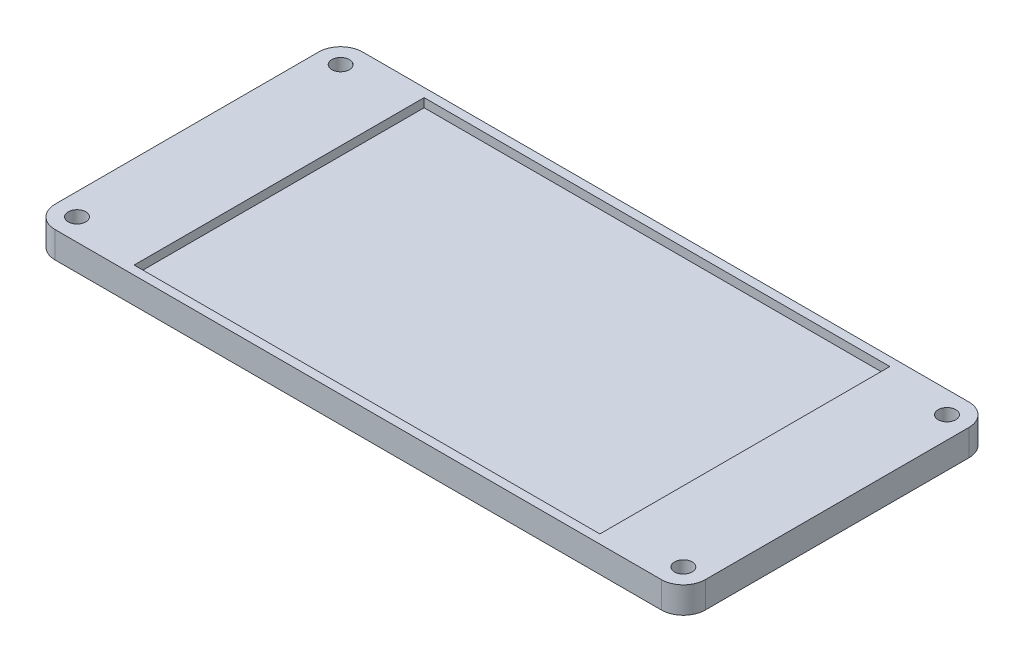
ISO-10303-21;
HEADER;
FILE_DESCRIPTION(('STEP AP214'),'2;1');
FILE_NAME('part.step','',(''),(''),'','','');
FILE_SCHEMA(('AUTOMOTIVE_DESIGN { 1 0 10303 214 1 1 1 1 }'));
ENDSEC;
DATA;
#1=APPLICATION_CONTEXT('core data for automotive mechanical design processes');
#2=APPLICATION_PROTOCOL_DEFINITION('international standard','automotive_design',2000,#1);
#3=PRODUCT_CONTEXT('',#1,'mechanical');
#4=PRODUCT('Part','Part','',(#3));
#5=PRODUCT_RELATED_PRODUCT_CATEGORY('part','',(#4));
#6=PRODUCT_DEFINITION_FORMATION('','',#4);
#7=PRODUCT_DEFINITION_CONTEXT('part definition',#1,'design');
#8=PRODUCT_DEFINITION('design','',#6,#7);
#9=PRODUCT_DEFINITION_SHAPE('','',#8);
#10=(LENGTH_UNIT() NAMED_UNIT(*) SI_UNIT(.MILLI.,.METRE.));
#11=(NAMED_UNIT(*) PLANE_ANGLE_UNIT() SI_UNIT($,.RADIAN.));
#12=(NAMED_UNIT(*) SI_UNIT($,.STERADIAN.) SOLID_ANGLE_UNIT());
#13=UNCERTAINTY_MEASURE_WITH_UNIT(LENGTH_MEASURE(1.E-05),#10,'distance_accuracy_value','');
#14=(GEOMETRIC_REPRESENTATION_CONTEXT(3) GLOBAL_UNCERTAINTY_ASSIGNED_CONTEXT((#13)) GLOBAL_UNIT_ASSIGNED_CONTEXT((#10,
#11,#12)) REPRESENTATION_CONTEXT('',''));
#15=CARTESIAN_POINT('',(0.,0.,0.));
#16=DIRECTION('',(0.,0.,1.));
#17=DIRECTION('',(1.,0.,0.));
#18=AXIS2_PLACEMENT_3D('',#15,#16,#17);
#19=CARTESIAN_POINT('',(37.,3.,17.5));
#20=DIRECTION('',(-1.,0.,0.));
#21=DIRECTION('',(0.,0.,1.));
#22=AXIS2_PLACEMENT_3D('',#19,#20,#21);
#23=PLANE('',#22);
#24=DIRECTION('',(0.,0.,-1.));
#25=VECTOR('',#24,1.);
#26=CARTESIAN_POINT('',(37.,0.,17.5));
#27=LINE('',#26,#25);
#28=CARTESIAN_POINT('',(37.,0.,15.));
#29=VERTEX_POINT('',#28);
#30=CARTESIAN_POINT('',(37.,0.,-15.));
#31=VERTEX_POINT('',#30);
#32=EDGE_CURVE('E170',#29,#31,#27,.T.);
#33=ORIENTED_EDGE('',*,*,#32,.T.);
#34=DIRECTION('',(0.,-1.,0.));
#35=VECTOR('',#34,1.);
#36=CARTESIAN_POINT('',(37.,3.,-15.));
#37=LINE('',#36,#35);
#38=CARTESIAN_POINT('',(37.,3.,-15.));
#39=VERTEX_POINT('',#38);
#40=EDGE_CURVE('E11',#31,#39,#37,.F.);
#41=ORIENTED_EDGE('',*,*,#40,.T.);
#42=DIRECTION('',(0.,0.,-1.));
#43=VECTOR('',#42,1.);
#44=CARTESIAN_POINT('',(37.,3.,17.5));
#45=LINE('',#44,#43);
#46=CARTESIAN_POINT('',(37.,3.,15.));
#47=VERTEX_POINT('',#46);
#48=EDGE_CURVE('E174',#47,#39,#45,.T.);
#49=ORIENTED_EDGE('',*,*,#48,.F.);
#50=DIRECTION('',(0.,-1.,0.));
#51=VECTOR('',#50,1.);
#52=CARTESIAN_POINT('',(37.,3.,15.));
#53=LINE('',#52,#51);
#54=EDGE_CURVE('E45',#47,#29,#53,.T.);
#55=ORIENTED_EDGE('',*,*,#54,.T.);
#56=EDGE_LOOP('',(#33,#41,#49,#55));
#57=FACE_BOUND('',#56,.T.);
#58=ADVANCED_FACE('F37',(#57),#23,.F.);
#59=CARTESIAN_POINT('',(-37.,3.,-17.5));
#60=DIRECTION('',(0.,0.,1.));
#61=DIRECTION('',(1.,0.,0.));
#62=AXIS2_PLACEMENT_3D('',#59,#60,#61);
#63=PLANE('',#62);
#64=DIRECTION('',(-1.,0.,0.));
#65=VECTOR('',#64,1.);
#66=CARTESIAN_POINT('',(-37.,0.,-17.5));
#67=LINE('',#66,#65);
#68=CARTESIAN_POINT('',(34.5,0.,-17.5));
#69=VERTEX_POINT('',#68);
#70=CARTESIAN_POINT('',(-34.5,0.,-17.5));
#71=VERTEX_POINT('',#70);
#72=EDGE_CURVE('E188',#69,#71,#67,.T.);
#73=ORIENTED_EDGE('',*,*,#72,.T.);
#74=DIRECTION('',(0.,-1.,0.));
#75=VECTOR('',#74,1.);
#76=CARTESIAN_POINT('',(-34.5,3.,-17.5));
#77=LINE('',#76,#75);
#78=CARTESIAN_POINT('',(-34.5,3.,-17.5));
#79=VERTEX_POINT('',#78);
#80=EDGE_CURVE('E52',#71,#79,#77,.F.);
#81=ORIENTED_EDGE('',*,*,#80,.T.);
#82=DIRECTION('',(-1.,0.,0.));
#83=VECTOR('',#82,1.);
#84=CARTESIAN_POINT('',(-37.,3.,-17.5));
#85=LINE('',#84,#83);
#86=CARTESIAN_POINT('',(34.5,3.,-17.5));
#87=VERTEX_POINT('',#86);
#88=EDGE_CURVE('E176',#87,#79,#85,.T.);
#89=ORIENTED_EDGE('',*,*,#88,.F.);
#90=DIRECTION('',(0.,-1.,0.));
#91=VECTOR('',#90,1.);
#92=CARTESIAN_POINT('',(34.5,3.,-17.5));
#93=LINE('',#92,#91);
#94=EDGE_CURVE('E219',#87,#69,#93,.T.);
#95=ORIENTED_EDGE('',*,*,#94,.T.);
#96=EDGE_LOOP('',(#73,#81,#89,#95));
#97=FACE_BOUND('',#96,.T.);
#98=ADVANCED_FACE('F237',(#97),#63,.F.);
#99=CARTESIAN_POINT('',(-37.,3.,17.5));
#100=DIRECTION('',(1.,0.,0.));
#101=DIRECTION('',(0.,0.,-1.));
#102=AXIS2_PLACEMENT_3D('',#99,#100,#101);
#103=PLANE('',#102);
#104=DIRECTION('',(0.,0.,1.));
#105=VECTOR('',#104,1.);
#106=CARTESIAN_POINT('',(-37.,0.,17.5));
#107=LINE('',#106,#105);
#108=CARTESIAN_POINT('',(-37.,0.,-15.));
#109=VERTEX_POINT('',#108);
#110=CARTESIAN_POINT('',(-37.,0.,15.));
#111=VERTEX_POINT('',#110);
#112=EDGE_CURVE('E190',#109,#111,#107,.T.);
#113=ORIENTED_EDGE('',*,*,#112,.T.);
#114=DIRECTION('',(0.,-1.,0.));
#115=VECTOR('',#114,1.);
#116=CARTESIAN_POINT('',(-37.,3.,15.));
#117=LINE('',#116,#115);
#118=CARTESIAN_POINT('',(-37.,3.,15.));
#119=VERTEX_POINT('',#118);
#120=EDGE_CURVE('E210',#111,#119,#117,.F.);
#121=ORIENTED_EDGE('',*,*,#120,.T.);
#122=DIRECTION('',(0.,0.,1.));
#123=VECTOR('',#122,1.);
#124=CARTESIAN_POINT('',(-37.,3.,17.5));
#125=LINE('',#124,#123);
#126=CARTESIAN_POINT('',(-37.,3.,-15.));
#127=VERTEX_POINT('',#126);
#128=EDGE_CURVE('E179',#127,#119,#125,.T.);
#129=ORIENTED_EDGE('',*,*,#128,.F.);
#130=DIRECTION('',(0.,-1.,0.));
#131=VECTOR('',#130,1.);
#132=CARTESIAN_POINT('',(-37.,3.,-15.));
#133=LINE('',#132,#131);
#134=EDGE_CURVE('E207',#127,#109,#133,.T.);
#135=ORIENTED_EDGE('',*,*,#134,.T.);
#136=EDGE_LOOP('',(#113,#121,#129,#135));
#137=FACE_BOUND('',#136,.T.);
#138=ADVANCED_FACE('F246',(#137),#103,.F.);
#139=CARTESIAN_POINT('',(-37.,3.,17.5));
#140=DIRECTION('',(0.,0.,-1.));
#141=DIRECTION('',(-1.,0.,0.));
#142=AXIS2_PLACEMENT_3D('',#139,#140,#141);
#143=PLANE('',#142);
#144=DIRECTION('',(1.,0.,0.));
#145=VECTOR('',#144,1.);
#146=CARTESIAN_POINT('',(-37.,3.,17.5));
#147=LINE('',#146,#145);
#148=CARTESIAN_POINT('',(-34.5,3.,17.5));
#149=VERTEX_POINT('',#148);
#150=CARTESIAN_POINT('',(34.5,3.,17.5));
#151=VERTEX_POINT('',#150);
#152=EDGE_CURVE('E182',#149,#151,#147,.T.);
#153=ORIENTED_EDGE('',*,*,#152,.F.);
#154=DIRECTION('',(0.,-1.,0.));
#155=VECTOR('',#154,1.);
#156=CARTESIAN_POINT('',(-34.5,3.,17.5));
#157=LINE('',#156,#155);
#158=CARTESIAN_POINT('',(-34.5,0.,17.5));
#159=VERTEX_POINT('',#158);
#160=EDGE_CURVE('E196',#149,#159,#157,.T.);
#161=ORIENTED_EDGE('',*,*,#160,.T.);
#162=DIRECTION('',(1.,0.,0.));
#163=VECTOR('',#162,1.);
#164=CARTESIAN_POINT('',(-37.,0.,17.5));
#165=LINE('',#164,#163);
#166=CARTESIAN_POINT('',(34.5,0.,17.5));
#167=VERTEX_POINT('',#166);
#168=EDGE_CURVE('E177',#159,#167,#165,.T.);
#169=ORIENTED_EDGE('',*,*,#168,.T.);
#170=DIRECTION('',(0.,-1.,0.));
#171=VECTOR('',#170,1.);
#172=CARTESIAN_POINT('',(34.5,3.,17.5));
#173=LINE('',#172,#171);
#174=EDGE_CURVE('E185',#167,#151,#173,.F.);
#175=ORIENTED_EDGE('',*,*,#174,.T.);
#176=EDGE_LOOP('',(#153,#161,#169,#175));
#177=FACE_BOUND('',#176,.T.);
#178=ADVANCED_FACE('F254',(#177),#143,.F.);
#179=CARTESIAN_POINT('',(0.,3.,0.));
#180=DIRECTION('',(0.,-1.,0.));
#181=DIRECTION('',(0.,0.,-1.));
#182=AXIS2_PLACEMENT_3D('',#179,#180,#181);
#183=PLANE('',#182);
#184=CARTESIAN_POINT('',(34.5,3.,-15.));
#185=DIRECTION('',(0.,-1.,0.));
#186=DIRECTION('',(0.,0.,1.));
#187=AXIS2_PLACEMENT_3D('',#184,#185,#186);
#188=CIRCLE('',#187,0.999999999999998);
#189=CARTESIAN_POINT('',(34.5,3.,-14.));
#190=VERTEX_POINT('',#189);
#191=EDGE_CURVE('E446',#190,#190,#188,.T.);
#192=ORIENTED_EDGE('',*,*,#191,.T.);
#193=EDGE_LOOP('',(#192));
#194=FACE_BOUND('',#193,.T.);
#195=CARTESIAN_POINT('',(34.5,3.,15.));
#196=DIRECTION('',(0.,1.,0.));
#197=DIRECTION('',(0.,0.,-1.));
#198=AXIS2_PLACEMENT_3D('',#195,#196,#197);
#199=CIRCLE('',#198,0.999999999999998);
#200=CARTESIAN_POINT('',(34.5,3.,14.));
#201=VERTEX_POINT('',#200);
#202=EDGE_CURVE('E440',#201,#201,#199,.T.);
#203=ORIENTED_EDGE('',*,*,#202,.F.);
#204=EDGE_LOOP('',(#203));
#205=FACE_BOUND('',#204,.T.);
#206=CARTESIAN_POINT('',(-34.5,3.,15.));
#207=DIRECTION('',(0.,-1.,0.));
#208=DIRECTION('',(0.,0.,-1.));
#209=AXIS2_PLACEMENT_3D('',#206,#207,#208);
#210=CIRCLE('',#209,0.999999999999998);
#211=CARTESIAN_POINT('',(-34.5,3.,14.));
#212=VERTEX_POINT('',#211);
#213=EDGE_CURVE('E433',#212,#212,#210,.T.);
#214=ORIENTED_EDGE('',*,*,#213,.T.);
#215=EDGE_LOOP('',(#214));
#216=FACE_BOUND('',#215,.T.);
#217=CARTESIAN_POINT('',(-34.5,3.,-15.));
#218=DIRECTION('',(0.,1.,0.));
#219=DIRECTION('',(0.,0.,1.));
#220=AXIS2_PLACEMENT_3D('',#217,#218,#219);
#221=CIRCLE('',#220,0.999999999999998);
#222=CARTESIAN_POINT('',(-34.5,3.,-14.));
#223=VERTEX_POINT('',#222);
#224=EDGE_CURVE('E157',#223,#223,#221,.T.);
#225=ORIENTED_EDGE('',*,*,#224,.F.);
#226=EDGE_LOOP('',(#225));
#227=FACE_BOUND('',#226,.T.);
#228=DIRECTION('',(-1.,0.,0.));
#229=VECTOR('',#228,1.);
#230=CARTESIAN_POINT('',(-26.5,3.,-16.5));
#231=LINE('',#230,#229);
#232=CARTESIAN_POINT('',(26.5,3.,-16.5));
#233=VERTEX_POINT('',#232);
#234=CARTESIAN_POINT('',(-26.5,3.,-16.5));
#235=VERTEX_POINT('',#234);
#236=EDGE_CURVE('E163',#233,#235,#231,.T.);
#237=ORIENTED_EDGE('',*,*,#236,.F.);
#238=DIRECTION('',(0.,0.,-1.));
#239=VECTOR('',#238,1.);
#240=CARTESIAN_POINT('',(26.5,3.,16.5));
#241=LINE('',#240,#239);
#242=CARTESIAN_POINT('',(26.5,3.,16.5));
#243=VERTEX_POINT('',#242);
#244=EDGE_CURVE('E134',#243,#233,#241,.T.);
#245=ORIENTED_EDGE('',*,*,#244,.F.);
#246=DIRECTION('',(1.,0.,0.));
#247=VECTOR('',#246,1.);
#248=CARTESIAN_POINT('',(-26.5,3.,16.5));
#249=LINE('',#248,#247);
#250=CARTESIAN_POINT('',(-26.5,3.,16.5));
#251=VERTEX_POINT('',#250);
#252=EDGE_CURVE('E151',#251,#243,#249,.T.);
#253=ORIENTED_EDGE('',*,*,#252,.F.);
#254=DIRECTION('',(0.,0.,1.));
#255=VECTOR('',#254,1.);
#256=CARTESIAN_POINT('',(-26.5,3.,16.5));
#257=LINE('',#256,#255);
#258=EDGE_CURVE('E154',#235,#251,#257,.T.);
#259=ORIENTED_EDGE('',*,*,#258,.F.);
#260=EDGE_LOOP('',(#237,#245,#253,#259));
#261=FACE_BOUND('',#260,.T.);
#262=ORIENTED_EDGE('',*,*,#128,.T.);
#263=CARTESIAN_POINT('',(-34.5,3.,15.));
#264=DIRECTION('',(0.,-1.,0.));
#265=DIRECTION('',(0.,0.,-1.));
#266=AXIS2_PLACEMENT_3D('',#263,#264,#265);
#267=CIRCLE('',#266,2.5);
#268=EDGE_CURVE('E217',#119,#149,#267,.F.);
#269=ORIENTED_EDGE('',*,*,#268,.T.);
#270=ORIENTED_EDGE('',*,*,#152,.T.);
#271=CARTESIAN_POINT('',(34.5,3.,15.));
#272=DIRECTION('',(0.,-1.,0.));
#273=DIRECTION('',(0.,0.,-1.));
#274=AXIS2_PLACEMENT_3D('',#271,#272,#273);
#275=CIRCLE('',#274,2.5);
#276=EDGE_CURVE('E212',#151,#47,#275,.F.);
#277=ORIENTED_EDGE('',*,*,#276,.T.);
#278=ORIENTED_EDGE('',*,*,#48,.T.);
#279=CARTESIAN_POINT('',(34.5,3.,-15.));
#280=DIRECTION('',(0.,-1.,0.));
#281=DIRECTION('',(0.,0.,-1.));
#282=AXIS2_PLACEMENT_3D('',#279,#280,#281);
#283=CIRCLE('',#282,2.5);
#284=EDGE_CURVE('E59',#39,#87,#283,.F.);
#285=ORIENTED_EDGE('',*,*,#284,.T.);
#286=ORIENTED_EDGE('',*,*,#88,.T.);
#287=CARTESIAN_POINT('',(-34.5,3.,-15.));
#288=DIRECTION('',(0.,-1.,0.));
#289=DIRECTION('',(0.,0.,-1.));
#290=AXIS2_PLACEMENT_3D('',#287,#288,#289);
#291=CIRCLE('',#290,2.5);
#292=EDGE_CURVE('E215',#79,#127,#291,.F.);
#293=ORIENTED_EDGE('',*,*,#292,.T.);
#294=EDGE_LOOP('',(#262,#269,#270,#277,#278,#285,#286,#293));
#295=FACE_BOUND('',#294,.T.);
#296=ADVANCED_FACE('F239',(#194,#205,#216,#227,#261,#295),#183,.F.);
#297=CARTESIAN_POINT('',(0.,0.,0.));
#298=DIRECTION('',(0.,-1.,0.));
#299=DIRECTION('',(0.,0.,-1.));
#300=AXIS2_PLACEMENT_3D('',#297,#298,#299);
#301=PLANE('',#300);
#302=CARTESIAN_POINT('',(34.5,0.,-15.));
#303=DIRECTION('',(0.,-1.,0.));
#304=DIRECTION('',(0.,0.,1.));
#305=AXIS2_PLACEMENT_3D('',#302,#303,#304);
#306=CIRCLE('',#305,0.999999999999998);
#307=CARTESIAN_POINT('',(34.5,0.,-14.));
#308=VERTEX_POINT('',#307);
#309=EDGE_CURVE('E443',#308,#308,#306,.T.);
#310=ORIENTED_EDGE('',*,*,#309,.F.);
#311=EDGE_LOOP('',(#310));
#312=FACE_BOUND('',#311,.T.);
#313=CARTESIAN_POINT('',(34.5,0.,15.));
#314=DIRECTION('',(0.,1.,0.));
#315=DIRECTION('',(0.,0.,-1.));
#316=AXIS2_PLACEMENT_3D('',#313,#314,#315);
#317=CIRCLE('',#316,0.999999999999998);
#318=CARTESIAN_POINT('',(34.5,0.,14.));
#319=VERTEX_POINT('',#318);
#320=EDGE_CURVE('E437',#319,#319,#317,.T.);
#321=ORIENTED_EDGE('',*,*,#320,.T.);
#322=EDGE_LOOP('',(#321));
#323=FACE_BOUND('',#322,.T.);
#324=CARTESIAN_POINT('',(-34.5,0.,15.));
#325=DIRECTION('',(0.,-1.,0.));
#326=DIRECTION('',(0.,0.,-1.));
#327=AXIS2_PLACEMENT_3D('',#324,#325,#326);
#328=CIRCLE('',#327,0.999999999999998);
#329=CARTESIAN_POINT('',(-34.5,0.,14.));
#330=VERTEX_POINT('',#329);
#331=EDGE_CURVE('E431',#330,#330,#328,.T.);
#332=ORIENTED_EDGE('',*,*,#331,.F.);
#333=EDGE_LOOP('',(#332));
#334=FACE_BOUND('',#333,.T.);
#335=CARTESIAN_POINT('',(-34.5,0.,-15.));
#336=DIRECTION('',(0.,1.,0.));
#337=DIRECTION('',(0.,0.,1.));
#338=AXIS2_PLACEMENT_3D('',#335,#336,#337);
#339=CIRCLE('',#338,0.999999999999998);
#340=CARTESIAN_POINT('',(-34.5,0.,-14.));
#341=VERTEX_POINT('',#340);
#342=EDGE_CURVE('E164',#341,#341,#339,.T.);
#343=ORIENTED_EDGE('',*,*,#342,.T.);
#344=EDGE_LOOP('',(#343));
#345=FACE_BOUND('',#344,.T.);
#346=ORIENTED_EDGE('',*,*,#168,.F.);
#347=CARTESIAN_POINT('',(-34.5,0.,15.));
#348=DIRECTION('',(0.,-1.,0.));
#349=DIRECTION('',(0.,0.,-1.));
#350=AXIS2_PLACEMENT_3D('',#347,#348,#349);
#351=CIRCLE('',#350,2.5);
#352=EDGE_CURVE('E205',#159,#111,#351,.T.);
#353=ORIENTED_EDGE('',*,*,#352,.T.);
#354=ORIENTED_EDGE('',*,*,#112,.F.);
#355=CARTESIAN_POINT('',(-34.5,0.,-15.));
#356=DIRECTION('',(0.,-1.,0.));
#357=DIRECTION('',(0.,0.,-1.));
#358=AXIS2_PLACEMENT_3D('',#355,#356,#357);
#359=CIRCLE('',#358,2.5);
#360=EDGE_CURVE('E203',#109,#71,#359,.T.);
#361=ORIENTED_EDGE('',*,*,#360,.T.);
#362=ORIENTED_EDGE('',*,*,#72,.F.);
#363=CARTESIAN_POINT('',(34.5,0.,-15.));
#364=DIRECTION('',(0.,-1.,0.));
#365=DIRECTION('',(0.,0.,-1.));
#366=AXIS2_PLACEMENT_3D('',#363,#364,#365);
#367=CIRCLE('',#366,2.5);
#368=EDGE_CURVE('E201',#69,#31,#367,.T.);
#369=ORIENTED_EDGE('',*,*,#368,.T.);
#370=ORIENTED_EDGE('',*,*,#32,.F.);
#371=CARTESIAN_POINT('',(34.5,0.,15.));
#372=DIRECTION('',(0.,-1.,0.));
#373=DIRECTION('',(0.,0.,-1.));
#374=AXIS2_PLACEMENT_3D('',#371,#372,#373);
#375=CIRCLE('',#374,2.5);
#376=EDGE_CURVE('E199',#29,#167,#375,.T.);
#377=ORIENTED_EDGE('',*,*,#376,.T.);
#378=EDGE_LOOP('',(#346,#353,#354,#361,#362,#369,#370,#377));
#379=FACE_BOUND('',#378,.T.);
#380=ADVANCED_FACE('F232',(#312,#323,#334,#345,#379),#301,.T.);
#381=CARTESIAN_POINT('',(26.5,2.,16.5));
#382=DIRECTION('',(1.,0.,0.));
#383=DIRECTION('',(0.,0.,-1.));
#384=AXIS2_PLACEMENT_3D('',#381,#382,#383);
#385=PLANE('',#384);
#386=ORIENTED_EDGE('',*,*,#244,.T.);
#387=DIRECTION('',(0.,1.,0.));
#388=VECTOR('',#387,1.);
#389=CARTESIAN_POINT('',(26.5,2.,-16.5));
#390=LINE('',#389,#388);
#391=CARTESIAN_POINT('',(26.5,2.,-16.5));
#392=VERTEX_POINT('',#391);
#393=EDGE_CURVE('E127',#392,#233,#390,.T.);
#394=ORIENTED_EDGE('',*,*,#393,.F.);
#395=DIRECTION('',(0.,0.,-1.));
#396=VECTOR('',#395,1.);
#397=CARTESIAN_POINT('',(26.5,2.,16.5));
#398=LINE('',#397,#396);
#399=CARTESIAN_POINT('',(26.5,2.,16.5));
#400=VERTEX_POINT('',#399);
#401=EDGE_CURVE('E131',#400,#392,#398,.T.);
#402=ORIENTED_EDGE('',*,*,#401,.F.);
#403=DIRECTION('',(0.,1.,0.));
#404=VECTOR('',#403,1.);
#405=CARTESIAN_POINT('',(26.5,2.,16.5));
#406=LINE('',#405,#404);
#407=EDGE_CURVE('E168',#400,#243,#406,.T.);
#408=ORIENTED_EDGE('',*,*,#407,.T.);
#409=EDGE_LOOP('',(#386,#394,#402,#408));
#410=FACE_BOUND('',#409,.T.);
#411=ADVANCED_FACE('F129',(#410),#385,.F.);
#412=CARTESIAN_POINT('',(-26.5,2.,16.5));
#413=DIRECTION('',(0.,0.,1.));
#414=DIRECTION('',(1.,0.,0.));
#415=AXIS2_PLACEMENT_3D('',#412,#413,#414);
#416=PLANE('',#415);
#417=ORIENTED_EDGE('',*,*,#252,.T.);
#418=ORIENTED_EDGE('',*,*,#407,.F.);
#419=DIRECTION('',(1.,0.,0.));
#420=VECTOR('',#419,1.);
#421=CARTESIAN_POINT('',(-26.5,2.,16.5));
#422=LINE('',#421,#420);
#423=CARTESIAN_POINT('',(-26.5,2.,16.5));
#424=VERTEX_POINT('',#423);
#425=EDGE_CURVE('E139',#424,#400,#422,.T.);
#426=ORIENTED_EDGE('',*,*,#425,.F.);
#427=DIRECTION('',(0.,1.,0.));
#428=VECTOR('',#427,1.);
#429=CARTESIAN_POINT('',(-26.5,2.,16.5));
#430=LINE('',#429,#428);
#431=EDGE_CURVE('E171',#424,#251,#430,.T.);
#432=ORIENTED_EDGE('',*,*,#431,.T.);
#433=EDGE_LOOP('',(#417,#418,#426,#432));
#434=FACE_BOUND('',#433,.T.);
#435=ADVANCED_FACE('F348',(#434),#416,.F.);
#436=CARTESIAN_POINT('',(-26.5,2.,16.5));
#437=DIRECTION('',(-1.,0.,0.));
#438=DIRECTION('',(0.,0.,1.));
#439=AXIS2_PLACEMENT_3D('',#436,#437,#438);
#440=PLANE('',#439);
#441=ORIENTED_EDGE('',*,*,#258,.T.);
#442=ORIENTED_EDGE('',*,*,#431,.F.);
#443=DIRECTION('',(0.,0.,1.));
#444=VECTOR('',#443,1.);
#445=CARTESIAN_POINT('',(-26.5,2.,16.5));
#446=LINE('',#445,#444);
#447=CARTESIAN_POINT('',(-26.5,2.,-16.5));
#448=VERTEX_POINT('',#447);
#449=EDGE_CURVE('E147',#448,#424,#446,.T.);
#450=ORIENTED_EDGE('',*,*,#449,.F.);
#451=DIRECTION('',(0.,1.,0.));
#452=VECTOR('',#451,1.);
#453=CARTESIAN_POINT('',(-26.5,2.,-16.5));
#454=LINE('',#453,#452);
#455=EDGE_CURVE('E138',#448,#235,#454,.T.);
#456=ORIENTED_EDGE('',*,*,#455,.T.);
#457=EDGE_LOOP('',(#441,#442,#450,#456));
#458=FACE_BOUND('',#457,.T.);
#459=ADVANCED_FACE('F351',(#458),#440,.F.);
#460=CARTESIAN_POINT('',(-26.5,2.,-16.5));
#461=DIRECTION('',(0.,0.,-1.));
#462=DIRECTION('',(-1.,0.,0.));
#463=AXIS2_PLACEMENT_3D('',#460,#461,#462);
#464=PLANE('',#463);
#465=ORIENTED_EDGE('',*,*,#236,.T.);
#466=ORIENTED_EDGE('',*,*,#455,.F.);
#467=DIRECTION('',(-1.,0.,0.));
#468=VECTOR('',#467,1.);
#469=CARTESIAN_POINT('',(-26.5,2.,-16.5));
#470=LINE('',#469,#468);
#471=EDGE_CURVE('E142',#392,#448,#470,.T.);
#472=ORIENTED_EDGE('',*,*,#471,.F.);
#473=ORIENTED_EDGE('',*,*,#393,.T.);
#474=EDGE_LOOP('',(#465,#466,#472,#473));
#475=FACE_BOUND('',#474,.T.);
#476=ADVANCED_FACE('F143',(#475),#464,.F.);
#477=CARTESIAN_POINT('',(0.,2.,0.));
#478=DIRECTION('',(0.,-1.,0.));
#479=DIRECTION('',(0.,0.,-1.));
#480=AXIS2_PLACEMENT_3D('',#477,#478,#479);
#481=PLANE('',#480);
#482=ORIENTED_EDGE('',*,*,#401,.T.);
#483=ORIENTED_EDGE('',*,*,#471,.T.);
#484=ORIENTED_EDGE('',*,*,#449,.T.);
#485=ORIENTED_EDGE('',*,*,#425,.T.);
#486=EDGE_LOOP('',(#482,#483,#484,#485));
#487=FACE_BOUND('',#486,.T.);
#488=ADVANCED_FACE('F149',(#487),#481,.F.);
#489=CARTESIAN_POINT('',(-34.5,0.,-15.));
#490=DIRECTION('',(0.,1.,0.));
#491=DIRECTION('',(0.,0.,1.));
#492=AXIS2_PLACEMENT_3D('',#489,#490,#491);
#493=CYLINDRICAL_SURFACE('',#492,0.999999999999998);
#494=ORIENTED_EDGE('',*,*,#342,.F.);
#495=EDGE_LOOP('',(#494));
#496=FACE_BOUND('',#495,.T.);
#497=ORIENTED_EDGE('',*,*,#224,.T.);
#498=EDGE_LOOP('',(#497));
#499=FACE_BOUND('',#498,.T.);
#500=ADVANCED_FACE('F275',(#496,#499),#493,.F.);
#501=CARTESIAN_POINT('',(-34.5,3.,15.));
#502=DIRECTION('',(0.,-1.,0.));
#503=DIRECTION('',(0.,0.,-1.));
#504=AXIS2_PLACEMENT_3D('',#501,#502,#503);
#505=CYLINDRICAL_SURFACE('',#504,2.5);
#506=ORIENTED_EDGE('',*,*,#268,.F.);
#507=ORIENTED_EDGE('',*,*,#120,.F.);
#508=ORIENTED_EDGE('',*,*,#352,.F.);
#509=ORIENTED_EDGE('',*,*,#160,.F.);
#510=EDGE_LOOP('',(#506,#507,#508,#509));
#511=FACE_BOUND('',#510,.T.);
#512=ADVANCED_FACE('F251',(#511),#505,.T.);
#513=CARTESIAN_POINT('',(-34.5,3.,-15.));
#514=DIRECTION('',(0.,-1.,0.));
#515=DIRECTION('',(0.,0.,-1.));
#516=AXIS2_PLACEMENT_3D('',#513,#514,#515);
#517=CYLINDRICAL_SURFACE('',#516,2.5);
#518=ORIENTED_EDGE('',*,*,#292,.F.);
#519=ORIENTED_EDGE('',*,*,#80,.F.);
#520=ORIENTED_EDGE('',*,*,#360,.F.);
#521=ORIENTED_EDGE('',*,*,#134,.F.);
#522=EDGE_LOOP('',(#518,#519,#520,#521));
#523=FACE_BOUND('',#522,.T.);
#524=ADVANCED_FACE('F243',(#523),#517,.T.);
#525=CARTESIAN_POINT('',(34.5,3.,-15.));
#526=DIRECTION('',(0.,-1.,0.));
#527=DIRECTION('',(0.,0.,-1.));
#528=AXIS2_PLACEMENT_3D('',#525,#526,#527);
#529=CYLINDRICAL_SURFACE('',#528,2.5);
#530=ORIENTED_EDGE('',*,*,#284,.F.);
#531=ORIENTED_EDGE('',*,*,#40,.F.);
#532=ORIENTED_EDGE('',*,*,#368,.F.);
#533=ORIENTED_EDGE('',*,*,#94,.F.);
#534=EDGE_LOOP('',(#530,#531,#532,#533));
#535=FACE_BOUND('',#534,.T.);
#536=ADVANCED_FACE('F236',(#535),#529,.T.);
#537=CARTESIAN_POINT('',(34.5,3.,15.));
#538=DIRECTION('',(0.,-1.,0.));
#539=DIRECTION('',(0.,0.,-1.));
#540=AXIS2_PLACEMENT_3D('',#537,#538,#539);
#541=CYLINDRICAL_SURFACE('',#540,2.5);
#542=ORIENTED_EDGE('',*,*,#276,.F.);
#543=ORIENTED_EDGE('',*,*,#174,.F.);
#544=ORIENTED_EDGE('',*,*,#376,.F.);
#545=ORIENTED_EDGE('',*,*,#54,.F.);
#546=EDGE_LOOP('',(#542,#543,#544,#545));
#547=FACE_BOUND('',#546,.T.);
#548=ADVANCED_FACE('F39',(#547),#541,.T.);
#549=CARTESIAN_POINT('',(-34.5,0.,15.));
#550=DIRECTION('',(0.,1.,0.));
#551=DIRECTION('',(0.,0.,1.));
#552=AXIS2_PLACEMENT_3D('',#549,#550,#551);
#553=CYLINDRICAL_SURFACE('',#552,0.999999999999998);
#554=ORIENTED_EDGE('',*,*,#331,.T.);
#555=EDGE_LOOP('',(#554));
#556=FACE_BOUND('',#555,.T.);
#557=ORIENTED_EDGE('',*,*,#213,.F.);
#558=EDGE_LOOP('',(#557));
#559=FACE_BOUND('',#558,.T.);
#560=ADVANCED_FACE('F257',(#556,#559),#553,.F.);
#561=CARTESIAN_POINT('',(34.5,0.,15.));
#562=DIRECTION('',(0.,1.,0.));
#563=DIRECTION('',(0.,0.,1.));
#564=AXIS2_PLACEMENT_3D('',#561,#562,#563);
#565=CYLINDRICAL_SURFACE('',#564,0.999999999999998);
#566=ORIENTED_EDGE('',*,*,#320,.F.);
#567=EDGE_LOOP('',(#566));
#568=FACE_BOUND('',#567,.T.);
#569=ORIENTED_EDGE('',*,*,#202,.T.);
#570=EDGE_LOOP('',(#569));
#571=FACE_BOUND('',#570,.T.);
#572=ADVANCED_FACE('F262',(#568,#571),#565,.F.);
#573=CARTESIAN_POINT('',(34.5,0.,-15.));
#574=DIRECTION('',(0.,1.,0.));
#575=DIRECTION('',(0.,0.,1.));
#576=AXIS2_PLACEMENT_3D('',#573,#574,#575);
#577=CYLINDRICAL_SURFACE('',#576,0.999999999999998);
#578=ORIENTED_EDGE('',*,*,#309,.T.);
#579=EDGE_LOOP('',(#578));
#580=FACE_BOUND('',#579,.T.);
#581=ORIENTED_EDGE('',*,*,#191,.F.);
#582=EDGE_LOOP('',(#581));
#583=FACE_BOUND('',#582,.T.);
#584=ADVANCED_FACE('F327',(#580,#583),#577,.F.);
#585=CLOSED_SHELL('',(#58,#98,#138,#178,#296,#380,#411,#435,#459,#476,#488,#500,#512,#524,#536,
#548,#560,#572,#584));
#586=MANIFOLD_SOLID_BREP('B2',#585);
#587=ADVANCED_BREP_SHAPE_REPRESENTATION('',(#18,#586),#14);
#588=SHAPE_DEFINITION_REPRESENTATION(#9,#587);
ENDSEC;
END-ISO-10303-21;
